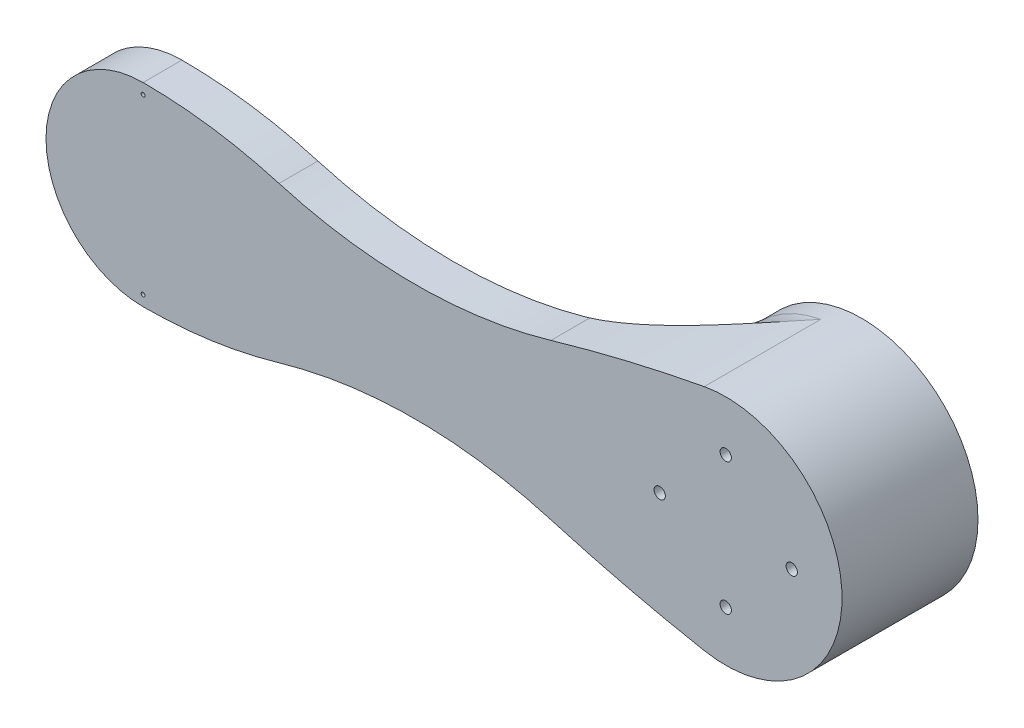
ISO-10303-21;
HEADER;
FILE_DESCRIPTION(('STEP AP214'),'2;1');
FILE_NAME('part.step','',(''),(''),'','','');
FILE_SCHEMA(('AUTOMOTIVE_DESIGN { 1 0 10303 214 1 1 1 1 }'));
ENDSEC;
DATA;
#1=APPLICATION_CONTEXT('core data for automotive mechanical design processes');
#2=APPLICATION_PROTOCOL_DEFINITION('international standard','automotive_design',2000,#1);
#3=PRODUCT_CONTEXT('',#1,'mechanical');
#4=PRODUCT('Part','Part','',(#3));
#5=PRODUCT_RELATED_PRODUCT_CATEGORY('part','',(#4));
#6=PRODUCT_DEFINITION_FORMATION('','',#4);
#7=PRODUCT_DEFINITION_CONTEXT('part definition',#1,'design');
#8=PRODUCT_DEFINITION('design','',#6,#7);
#9=PRODUCT_DEFINITION_SHAPE('','',#8);
#10=(LENGTH_UNIT() NAMED_UNIT(*) SI_UNIT(.MILLI.,.METRE.));
#11=(NAMED_UNIT(*) PLANE_ANGLE_UNIT() SI_UNIT($,.RADIAN.));
#12=(NAMED_UNIT(*) SI_UNIT($,.STERADIAN.) SOLID_ANGLE_UNIT());
#13=UNCERTAINTY_MEASURE_WITH_UNIT(LENGTH_MEASURE(1.E-05),#10,'distance_accuracy_value','');
#14=(GEOMETRIC_REPRESENTATION_CONTEXT(3) GLOBAL_UNCERTAINTY_ASSIGNED_CONTEXT((#13)) GLOBAL_UNIT_ASSIGNED_CONTEXT((#10,
#11,#12)) REPRESENTATION_CONTEXT('',''));
#15=CARTESIAN_POINT('',(0.,0.,0.));
#16=DIRECTION('',(0.,0.,1.));
#17=DIRECTION('',(1.,0.,0.));
#18=AXIS2_PLACEMENT_3D('',#15,#16,#17);
#19=CARTESIAN_POINT('',(0.,0.,30.));
#20=DIRECTION('',(0.,0.,-1.));
#21=DIRECTION('',(-1.,0.,0.));
#22=AXIS2_PLACEMENT_3D('',#19,#20,#21);
#23=CYLINDRICAL_SURFACE('',#22,29.95);
#24=CARTESIAN_POINT('',(0.,0.,0.));
#25=DIRECTION('',(0.,0.,1.));
#26=DIRECTION('',(1.,0.,0.));
#27=AXIS2_PLACEMENT_3D('',#24,#25,#26);
#28=CIRCLE('',#27,29.95);
#29=CARTESIAN_POINT('',(29.95,0.,0.));
#30=VERTEX_POINT('',#29);
#31=EDGE_CURVE('E207',#30,#30,#28,.T.);
#32=ORIENTED_EDGE('',*,*,#31,.T.);
#33=EDGE_LOOP('',(#32));
#34=FACE_BOUND('',#33,.T.);
#35=CARTESIAN_POINT('',(0.,0.,4.99999999999999));
#36=DIRECTION('',(0.,0.,-1.));
#37=DIRECTION('',(-1.,0.,0.));
#38=AXIS2_PLACEMENT_3D('',#35,#36,#37);
#39=CIRCLE('',#38,29.95);
#40=CARTESIAN_POINT('',(-5.52300923487327,-29.4363528479925,4.99999999999999));
#41=VERTEX_POINT('',#40);
#42=CARTESIAN_POINT('',(-5.52300923487327,29.4363528479923,4.99999999999999));
#43=VERTEX_POINT('',#42);
#44=EDGE_CURVE('E252',#41,#43,#39,.T.);
#45=ORIENTED_EDGE('',*,*,#44,.T.);
#46=DIRECTION('',(0.,0.,1.));
#47=VECTOR('',#46,1.);
#48=CARTESIAN_POINT('',(-5.52300923487331,29.4363528479925,25.));
#49=LINE('',#48,#47);
#50=CARTESIAN_POINT('',(-5.52300923487331,29.4363528479925,35.));
#51=VERTEX_POINT('',#50);
#52=EDGE_CURVE('E147',#43,#51,#49,.T.);
#53=ORIENTED_EDGE('',*,*,#52,.T.);
#54=CARTESIAN_POINT('',(0.,0.,35.));
#55=DIRECTION('',(0.,0.,1.));
#56=DIRECTION('',(1.,0.,0.));
#57=AXIS2_PLACEMENT_3D('',#54,#55,#56);
#58=CIRCLE('',#57,29.95);
#59=CARTESIAN_POINT('',(-5.52300923487268,-29.4363528479924,35.));
#60=VERTEX_POINT('',#59);
#61=EDGE_CURVE('E181',#60,#51,#58,.T.);
#62=ORIENTED_EDGE('',*,*,#61,.F.);
#63=DIRECTION('',(0.,0.,1.));
#64=VECTOR('',#63,1.);
#65=CARTESIAN_POINT('',(-5.52300923487327,-29.4363528479925,25.));
#66=LINE('',#65,#64);
#67=EDGE_CURVE('E165',#41,#60,#66,.T.);
#68=ORIENTED_EDGE('',*,*,#67,.F.);
#69=EDGE_LOOP('',(#45,#53,#62,#68));
#70=FACE_BOUND('',#69,.T.);
#71=ADVANCED_FACE('F36',(#34,#70),#23,.T.);
#72=CARTESIAN_POINT('',(0.,0.,0.));
#73=DIRECTION('',(0.,0.,1.));
#74=DIRECTION('',(1.,0.,0.));
#75=AXIS2_PLACEMENT_3D('',#72,#73,#74);
#76=PLANE('',#75);
#77=CARTESIAN_POINT('',(0.,0.,0.));
#78=DIRECTION('',(0.,0.,1.));
#79=DIRECTION('',(1.,0.,0.));
#80=AXIS2_PLACEMENT_3D('',#77,#78,#79);
#81=CIRCLE('',#80,26.95);
#82=CARTESIAN_POINT('',(26.95,0.,0.));
#83=VERTEX_POINT('',#82);
#84=EDGE_CURVE('E222',#83,#83,#81,.T.);
#85=ORIENTED_EDGE('',*,*,#84,.T.);
#86=EDGE_LOOP('',(#85));
#87=FACE_BOUND('',#86,.T.);
#88=ORIENTED_EDGE('',*,*,#31,.F.);
#89=EDGE_LOOP('',(#88));
#90=FACE_BOUND('',#89,.T.);
#91=ADVANCED_FACE('F336',(#87,#90),#76,.F.);
#92=CARTESIAN_POINT('',(0.,0.,30.));
#93=DIRECTION('',(0.,0.,-1.));
#94=DIRECTION('',(-1.,0.,0.));
#95=AXIS2_PLACEMENT_3D('',#92,#93,#94);
#96=CYLINDRICAL_SURFACE('',#95,24.95);
#97=CARTESIAN_POINT('',(0.,0.,2.));
#98=DIRECTION('',(0.,0.,1.));
#99=DIRECTION('',(1.,0.,0.));
#100=AXIS2_PLACEMENT_3D('',#97,#98,#99);
#101=CIRCLE('',#100,24.95);
#102=CARTESIAN_POINT('',(24.95,0.,2.));
#103=VERTEX_POINT('',#102);
#104=EDGE_CURVE('E225',#103,#103,#101,.F.);
#105=ORIENTED_EDGE('',*,*,#104,.T.);
#106=EDGE_LOOP('',(#105));
#107=FACE_BOUND('',#106,.T.);
#108=CARTESIAN_POINT('',(0.,0.,30.));
#109=DIRECTION('',(0.,0.,1.));
#110=DIRECTION('',(1.,0.,0.));
#111=AXIS2_PLACEMENT_3D('',#108,#109,#110);
#112=CIRCLE('',#111,24.95);
#113=CARTESIAN_POINT('',(24.95,0.,30.));
#114=VERTEX_POINT('',#113);
#115=EDGE_CURVE('E204',#114,#114,#112,.T.);
#116=ORIENTED_EDGE('',*,*,#115,.T.);
#117=EDGE_LOOP('',(#116));
#118=FACE_BOUND('',#117,.T.);
#119=ADVANCED_FACE('F332',(#107,#118),#96,.F.);
#120=CARTESIAN_POINT('',(0.,0.,30.));
#121=DIRECTION('',(0.,0.,1.));
#122=DIRECTION('',(1.,0.,0.));
#123=AXIS2_PLACEMENT_3D('',#120,#121,#122);
#124=PLANE('',#123);
#125=CARTESIAN_POINT('',(-17.,0.,30.));
#126=DIRECTION('',(0.,0.,1.));
#127=DIRECTION('',(1.,0.,0.));
#128=AXIS2_PLACEMENT_3D('',#125,#126,#127);
#129=CIRCLE('',#128,3.35);
#130=CARTESIAN_POINT('',(-13.65,0.,30.));
#131=VERTEX_POINT('',#130);
#132=EDGE_CURVE('E219',#131,#131,#129,.F.);
#133=ORIENTED_EDGE('',*,*,#132,.F.);
#134=EDGE_LOOP('',(#133));
#135=FACE_BOUND('',#134,.T.);
#136=CARTESIAN_POINT('',(0.,-17.,30.));
#137=DIRECTION('',(0.,0.,1.));
#138=DIRECTION('',(1.,0.,0.));
#139=AXIS2_PLACEMENT_3D('',#136,#137,#138);
#140=CIRCLE('',#139,3.35);
#141=CARTESIAN_POINT('',(3.35,-17.,30.));
#142=VERTEX_POINT('',#141);
#143=EDGE_CURVE('E216',#142,#142,#140,.F.);
#144=ORIENTED_EDGE('',*,*,#143,.F.);
#145=EDGE_LOOP('',(#144));
#146=FACE_BOUND('',#145,.T.);
#147=CARTESIAN_POINT('',(17.,0.,30.));
#148=DIRECTION('',(0.,0.,1.));
#149=DIRECTION('',(1.,0.,0.));
#150=AXIS2_PLACEMENT_3D('',#147,#148,#149);
#151=CIRCLE('',#150,3.35);
#152=CARTESIAN_POINT('',(20.35,0.,30.));
#153=VERTEX_POINT('',#152);
#154=EDGE_CURVE('E213',#153,#153,#151,.F.);
#155=ORIENTED_EDGE('',*,*,#154,.F.);
#156=EDGE_LOOP('',(#155));
#157=FACE_BOUND('',#156,.T.);
#158=CARTESIAN_POINT('',(0.,17.,30.));
#159=DIRECTION('',(0.,0.,1.));
#160=DIRECTION('',(1.,0.,0.));
#161=AXIS2_PLACEMENT_3D('',#158,#159,#160);
#162=CIRCLE('',#161,3.35);
#163=CARTESIAN_POINT('',(3.35,17.,30.));
#164=VERTEX_POINT('',#163);
#165=EDGE_CURVE('E210',#164,#164,#162,.F.);
#166=ORIENTED_EDGE('',*,*,#165,.F.);
#167=EDGE_LOOP('',(#166));
#168=FACE_BOUND('',#167,.T.);
#169=ORIENTED_EDGE('',*,*,#115,.F.);
#170=EDGE_LOOP('',(#169));
#171=FACE_BOUND('',#170,.T.);
#172=ADVANCED_FACE('F328',(#135,#146,#157,#168,#171),#124,.F.);
#173=CARTESIAN_POINT('',(0.,0.,35.));
#174=DIRECTION('',(0.,0.,1.));
#175=DIRECTION('',(1.,0.,0.));
#176=AXIS2_PLACEMENT_3D('',#173,#174,#175);
#177=PLANE('',#176);
#178=CARTESIAN_POINT('',(0.,17.,35.));
#179=DIRECTION('',(0.,0.,-1.));
#180=DIRECTION('',(-1.,0.,0.));
#181=AXIS2_PLACEMENT_3D('',#178,#179,#180);
#182=CIRCLE('',#181,1.45);
#183=CARTESIAN_POINT('',(-1.45,17.,35.));
#184=VERTEX_POINT('',#183);
#185=EDGE_CURVE('E178',#184,#184,#182,.T.);
#186=ORIENTED_EDGE('',*,*,#185,.T.);
#187=EDGE_LOOP('',(#186));
#188=FACE_BOUND('',#187,.T.);
#189=CARTESIAN_POINT('',(-17.,0.,35.));
#190=DIRECTION('',(0.,0.,-1.));
#191=DIRECTION('',(-1.,0.,0.));
#192=AXIS2_PLACEMENT_3D('',#189,#190,#191);
#193=CIRCLE('',#192,1.45);
#194=CARTESIAN_POINT('',(-18.45,0.,35.));
#195=VERTEX_POINT('',#194);
#196=EDGE_CURVE('E188',#195,#195,#193,.T.);
#197=ORIENTED_EDGE('',*,*,#196,.T.);
#198=EDGE_LOOP('',(#197));
#199=FACE_BOUND('',#198,.T.);
#200=CARTESIAN_POINT('',(17.,0.,35.));
#201=DIRECTION('',(0.,0.,-1.));
#202=DIRECTION('',(-1.,0.,0.));
#203=AXIS2_PLACEMENT_3D('',#200,#201,#202);
#204=CIRCLE('',#203,1.45);
#205=CARTESIAN_POINT('',(15.55,0.,35.));
#206=VERTEX_POINT('',#205);
#207=EDGE_CURVE('E194',#206,#206,#204,.T.);
#208=ORIENTED_EDGE('',*,*,#207,.T.);
#209=EDGE_LOOP('',(#208));
#210=FACE_BOUND('',#209,.T.);
#211=CARTESIAN_POINT('',(0.,-17.,35.));
#212=DIRECTION('',(0.,0.,-1.));
#213=DIRECTION('',(-1.,0.,0.));
#214=AXIS2_PLACEMENT_3D('',#211,#212,#213);
#215=CIRCLE('',#214,1.45);
#216=CARTESIAN_POINT('',(-1.45,-17.,35.));
#217=VERTEX_POINT('',#216);
#218=EDGE_CURVE('E168',#217,#217,#215,.T.);
#219=ORIENTED_EDGE('',*,*,#218,.T.);
#220=EDGE_LOOP('',(#219));
#221=FACE_BOUND('',#220,.T.);
#222=ORIENTED_EDGE('',*,*,#61,.T.);
#223=CARTESIAN_POINT('',(70.6322432432423,-376.453405405403,35.));
#224=DIRECTION('',(0.,0.,1.));
#225=DIRECTION('',(1.,0.,0.));
#226=AXIS2_PLACEMENT_3D('',#223,#224,#225);
#227=CIRCLE('',#226,412.972297297295);
#228=CARTESIAN_POINT('',(-45.,20.,35.));
#229=VERTEX_POINT('',#228);
#230=EDGE_CURVE('E148',#51,#229,#227,.T.);
#231=ORIENTED_EDGE('',*,*,#230,.T.);
#232=CARTESIAN_POINT('',(-80.,140.,35.));
#233=DIRECTION('',(0.,0.,-1.));
#234=DIRECTION('',(-1.,0.,0.));
#235=AXIS2_PLACEMENT_3D('',#232,#233,#234);
#236=CIRCLE('',#235,125.);
#237=CARTESIAN_POINT('',(-115.,20.,35.));
#238=VERTEX_POINT('',#237);
#239=EDGE_CURVE('E151',#229,#238,#236,.T.);
#240=ORIENTED_EDGE('',*,*,#239,.T.);
#241=CARTESIAN_POINT('',(-150.,-99.9999999999997,35.));
#242=DIRECTION('',(0.,0.,1.));
#243=DIRECTION('',(1.,0.,0.));
#244=AXIS2_PLACEMENT_3D('',#241,#242,#243);
#245=CIRCLE('',#244,125.);
#246=CARTESIAN_POINT('',(-150.,25.,35.));
#247=VERTEX_POINT('',#246);
#248=EDGE_CURVE('E128',#238,#247,#245,.T.);
#249=ORIENTED_EDGE('',*,*,#248,.T.);
#250=CARTESIAN_POINT('',(-150.,0.,35.));
#251=DIRECTION('',(0.,0.,1.));
#252=DIRECTION('',(1.,0.,0.));
#253=AXIS2_PLACEMENT_3D('',#250,#251,#252);
#254=CIRCLE('',#253,25.);
#255=CARTESIAN_POINT('',(-150.,-25.,35.));
#256=VERTEX_POINT('',#255);
#257=EDGE_CURVE('E155',#247,#256,#254,.T.);
#258=ORIENTED_EDGE('',*,*,#257,.T.);
#259=CARTESIAN_POINT('',(-150.,99.9999999999997,35.));
#260=DIRECTION('',(0.,0.,1.));
#261=DIRECTION('',(-1.,0.,0.));
#262=AXIS2_PLACEMENT_3D('',#259,#260,#261);
#263=CIRCLE('',#262,125.);
#264=CARTESIAN_POINT('',(-115.,-20.,35.));
#265=VERTEX_POINT('',#264);
#266=EDGE_CURVE('E158',#256,#265,#263,.T.);
#267=ORIENTED_EDGE('',*,*,#266,.T.);
#268=CARTESIAN_POINT('',(-80.,-140.,35.));
#269=DIRECTION('',(0.,0.,-1.));
#270=DIRECTION('',(1.,0.,0.));
#271=AXIS2_PLACEMENT_3D('',#268,#269,#270);
#272=CIRCLE('',#271,125.);
#273=CARTESIAN_POINT('',(-45.,-20.0000000000002,35.));
#274=VERTEX_POINT('',#273);
#275=EDGE_CURVE('E161',#265,#274,#272,.T.);
#276=ORIENTED_EDGE('',*,*,#275,.T.);
#277=CARTESIAN_POINT('',(70.6322432432423,376.453405405403,35.));
#278=DIRECTION('',(0.,0.,1.));
#279=DIRECTION('',(-1.,0.,0.));
#280=AXIS2_PLACEMENT_3D('',#277,#278,#279);
#281=CIRCLE('',#280,412.972297297295);
#282=EDGE_CURVE('E122',#274,#60,#281,.T.);
#283=ORIENTED_EDGE('',*,*,#282,.T.);
#284=EDGE_LOOP('',(#222,#231,#240,#249,#258,#267,#276,#283));
#285=FACE_BOUND('',#284,.T.);
#286=CARTESIAN_POINT('',(-150.,22.2789619905194,35.));
#287=DIRECTION('',(0.,0.,1.));
#288=DIRECTION('',(1.,0.,0.));
#289=AXIS2_PLACEMENT_3D('',#286,#287,#288);
#290=CIRCLE('',#289,0.499999999999999);
#291=CARTESIAN_POINT('',(-149.5,22.2789619905194,35.));
#292=VERTEX_POINT('',#291);
#293=EDGE_CURVE('E703',#292,#292,#290,.T.);
#294=ORIENTED_EDGE('',*,*,#293,.F.);
#295=EDGE_LOOP('',(#294));
#296=FACE_BOUND('',#295,.T.);
#297=CARTESIAN_POINT('',(-150.,-22.2789619905194,35.));
#298=DIRECTION('',(0.,0.,1.));
#299=DIRECTION('',(1.,0.,0.));
#300=AXIS2_PLACEMENT_3D('',#297,#298,#299);
#301=CIRCLE('',#300,0.499999999999999);
#302=CARTESIAN_POINT('',(-149.5,-22.2789619905194,35.));
#303=VERTEX_POINT('',#302);
#304=EDGE_CURVE('E698',#303,#303,#301,.T.);
#305=ORIENTED_EDGE('',*,*,#304,.F.);
#306=EDGE_LOOP('',(#305));
#307=FACE_BOUND('',#306,.T.);
#308=ADVANCED_FACE('F324',(#188,#199,#210,#221,#285,#296,#307),#177,.T.);
#309=CARTESIAN_POINT('',(0.,17.,25.));
#310=DIRECTION('',(0.,0.,1.));
#311=DIRECTION('',(1.,0.,0.));
#312=AXIS2_PLACEMENT_3D('',#309,#310,#311);
#313=CYLINDRICAL_SURFACE('',#312,3.35);
#314=CARTESIAN_POINT('',(0.,17.,26.));
#315=DIRECTION('',(0.,0.,-1.));
#316=DIRECTION('',(-1.,0.,0.));
#317=AXIS2_PLACEMENT_3D('',#314,#315,#316);
#318=CIRCLE('',#317,3.35);
#319=CARTESIAN_POINT('',(-3.35,17.,26.));
#320=VERTEX_POINT('',#319);
#321=EDGE_CURVE('E243',#320,#320,#318,.F.);
#322=ORIENTED_EDGE('',*,*,#321,.T.);
#323=EDGE_LOOP('',(#322));
#324=FACE_BOUND('',#323,.T.);
#325=ORIENTED_EDGE('',*,*,#165,.T.);
#326=EDGE_LOOP('',(#325));
#327=FACE_BOUND('',#326,.T.);
#328=ADVANCED_FACE('F320',(#324,#327),#313,.T.);
#329=CARTESIAN_POINT('',(0.,17.,25.));
#330=DIRECTION('',(0.,0.,-1.));
#331=DIRECTION('',(-1.,0.,0.));
#332=AXIS2_PLACEMENT_3D('',#329,#330,#331);
#333=PLANE('',#332);
#334=CARTESIAN_POINT('',(0.,17.,25.));
#335=DIRECTION('',(0.,0.,-1.));
#336=DIRECTION('',(-1.,0.,0.));
#337=AXIS2_PLACEMENT_3D('',#334,#335,#336);
#338=CIRCLE('',#337,2.35);
#339=CARTESIAN_POINT('',(-2.35,17.,25.));
#340=VERTEX_POINT('',#339);
#341=EDGE_CURVE('E240',#340,#340,#338,.T.);
#342=ORIENTED_EDGE('',*,*,#341,.T.);
#343=EDGE_LOOP('',(#342));
#344=FACE_BOUND('',#343,.T.);
#345=CARTESIAN_POINT('',(0.,17.,25.));
#346=DIRECTION('',(0.,0.,-1.));
#347=DIRECTION('',(-1.,0.,0.));
#348=AXIS2_PLACEMENT_3D('',#345,#346,#347);
#349=CIRCLE('',#348,1.45);
#350=CARTESIAN_POINT('',(-1.45,17.,25.));
#351=VERTEX_POINT('',#350);
#352=EDGE_CURVE('E182',#351,#351,#349,.T.);
#353=ORIENTED_EDGE('',*,*,#352,.F.);
#354=EDGE_LOOP('',(#353));
#355=FACE_BOUND('',#354,.T.);
#356=ADVANCED_FACE('F313',(#344,#355),#333,.T.);
#357=CARTESIAN_POINT('',(17.,0.,25.));
#358=DIRECTION('',(0.,0.,1.));
#359=DIRECTION('',(1.,0.,0.));
#360=AXIS2_PLACEMENT_3D('',#357,#358,#359);
#361=CYLINDRICAL_SURFACE('',#360,3.35);
#362=CARTESIAN_POINT('',(17.,0.,26.));
#363=DIRECTION('',(0.,0.,-1.));
#364=DIRECTION('',(-1.,0.,0.));
#365=AXIS2_PLACEMENT_3D('',#362,#363,#364);
#366=CIRCLE('',#365,3.35);
#367=CARTESIAN_POINT('',(13.65,0.,26.));
#368=VERTEX_POINT('',#367);
#369=EDGE_CURVE('E249',#368,#368,#366,.F.);
#370=ORIENTED_EDGE('',*,*,#369,.T.);
#371=EDGE_LOOP('',(#370));
#372=FACE_BOUND('',#371,.T.);
#373=ORIENTED_EDGE('',*,*,#154,.T.);
#374=EDGE_LOOP('',(#373));
#375=FACE_BOUND('',#374,.T.);
#376=ADVANCED_FACE('F310',(#372,#375),#361,.T.);
#377=CARTESIAN_POINT('',(17.,0.,25.));
#378=DIRECTION('',(0.,0.,-1.));
#379=DIRECTION('',(-1.,0.,0.));
#380=AXIS2_PLACEMENT_3D('',#377,#378,#379);
#381=PLANE('',#380);
#382=CARTESIAN_POINT('',(17.,0.,25.));
#383=DIRECTION('',(0.,0.,-1.));
#384=DIRECTION('',(-1.,0.,0.));
#385=AXIS2_PLACEMENT_3D('',#382,#383,#384);
#386=CIRCLE('',#385,2.35);
#387=CARTESIAN_POINT('',(14.65,0.,25.));
#388=VERTEX_POINT('',#387);
#389=EDGE_CURVE('E246',#388,#388,#386,.T.);
#390=ORIENTED_EDGE('',*,*,#389,.T.);
#391=EDGE_LOOP('',(#390));
#392=FACE_BOUND('',#391,.T.);
#393=CARTESIAN_POINT('',(17.,0.,25.));
#394=DIRECTION('',(0.,0.,-1.));
#395=DIRECTION('',(-1.,0.,0.));
#396=AXIS2_PLACEMENT_3D('',#393,#394,#395);
#397=CIRCLE('',#396,1.45);
#398=CARTESIAN_POINT('',(15.55,0.,25.));
#399=VERTEX_POINT('',#398);
#400=EDGE_CURVE('E191',#399,#399,#397,.T.);
#401=ORIENTED_EDGE('',*,*,#400,.F.);
#402=EDGE_LOOP('',(#401));
#403=FACE_BOUND('',#402,.T.);
#404=ADVANCED_FACE('F305',(#392,#403),#381,.T.);
#405=CARTESIAN_POINT('',(0.,-17.,25.));
#406=DIRECTION('',(0.,0.,1.));
#407=DIRECTION('',(1.,0.,0.));
#408=AXIS2_PLACEMENT_3D('',#405,#406,#407);
#409=CYLINDRICAL_SURFACE('',#408,3.35);
#410=CARTESIAN_POINT('',(0.,-17.,26.));
#411=DIRECTION('',(0.,0.,-1.));
#412=DIRECTION('',(-1.,0.,0.));
#413=AXIS2_PLACEMENT_3D('',#410,#411,#412);
#414=CIRCLE('',#413,3.35);
#415=CARTESIAN_POINT('',(-3.35,-17.,26.));
#416=VERTEX_POINT('',#415);
#417=EDGE_CURVE('E231',#416,#416,#414,.F.);
#418=ORIENTED_EDGE('',*,*,#417,.T.);
#419=EDGE_LOOP('',(#418));
#420=FACE_BOUND('',#419,.T.);
#421=ORIENTED_EDGE('',*,*,#143,.T.);
#422=EDGE_LOOP('',(#421));
#423=FACE_BOUND('',#422,.T.);
#424=ADVANCED_FACE('F302',(#420,#423),#409,.T.);
#425=CARTESIAN_POINT('',(0.,-17.,25.));
#426=DIRECTION('',(0.,0.,-1.));
#427=DIRECTION('',(-1.,0.,0.));
#428=AXIS2_PLACEMENT_3D('',#425,#426,#427);
#429=PLANE('',#428);
#430=CARTESIAN_POINT('',(0.,-17.,25.));
#431=DIRECTION('',(0.,0.,-1.));
#432=DIRECTION('',(-1.,0.,0.));
#433=AXIS2_PLACEMENT_3D('',#430,#431,#432);
#434=CIRCLE('',#433,2.35);
#435=CARTESIAN_POINT('',(-2.35,-17.,25.));
#436=VERTEX_POINT('',#435);
#437=EDGE_CURVE('E228',#436,#436,#434,.T.);
#438=ORIENTED_EDGE('',*,*,#437,.T.);
#439=EDGE_LOOP('',(#438));
#440=FACE_BOUND('',#439,.T.);
#441=CARTESIAN_POINT('',(0.,-17.,25.));
#442=DIRECTION('',(0.,0.,-1.));
#443=DIRECTION('',(-1.,0.,0.));
#444=AXIS2_PLACEMENT_3D('',#441,#442,#443);
#445=CIRCLE('',#444,1.45);
#446=CARTESIAN_POINT('',(-1.45,-17.,25.));
#447=VERTEX_POINT('',#446);
#448=EDGE_CURVE('E197',#447,#447,#445,.T.);
#449=ORIENTED_EDGE('',*,*,#448,.F.);
#450=EDGE_LOOP('',(#449));
#451=FACE_BOUND('',#450,.T.);
#452=ADVANCED_FACE('F297',(#440,#451),#429,.T.);
#453=CARTESIAN_POINT('',(-17.,0.,25.));
#454=DIRECTION('',(0.,0.,1.));
#455=DIRECTION('',(1.,0.,0.));
#456=AXIS2_PLACEMENT_3D('',#453,#454,#455);
#457=CYLINDRICAL_SURFACE('',#456,3.35);
#458=CARTESIAN_POINT('',(-17.,0.,26.));
#459=DIRECTION('',(0.,0.,-1.));
#460=DIRECTION('',(-1.,0.,0.));
#461=AXIS2_PLACEMENT_3D('',#458,#459,#460);
#462=CIRCLE('',#461,3.35);
#463=CARTESIAN_POINT('',(-20.35,0.,26.));
#464=VERTEX_POINT('',#463);
#465=EDGE_CURVE('E237',#464,#464,#462,.F.);
#466=ORIENTED_EDGE('',*,*,#465,.T.);
#467=EDGE_LOOP('',(#466));
#468=FACE_BOUND('',#467,.T.);
#469=ORIENTED_EDGE('',*,*,#132,.T.);
#470=EDGE_LOOP('',(#469));
#471=FACE_BOUND('',#470,.T.);
#472=ADVANCED_FACE('F294',(#468,#471),#457,.T.);
#473=CARTESIAN_POINT('',(-17.,0.,25.));
#474=DIRECTION('',(0.,0.,-1.));
#475=DIRECTION('',(-1.,0.,0.));
#476=AXIS2_PLACEMENT_3D('',#473,#474,#475);
#477=PLANE('',#476);
#478=CARTESIAN_POINT('',(-17.,0.,25.));
#479=DIRECTION('',(0.,0.,-1.));
#480=DIRECTION('',(-1.,0.,0.));
#481=AXIS2_PLACEMENT_3D('',#478,#479,#480);
#482=CIRCLE('',#481,2.35);
#483=CARTESIAN_POINT('',(-19.35,0.,25.));
#484=VERTEX_POINT('',#483);
#485=EDGE_CURVE('E234',#484,#484,#482,.T.);
#486=ORIENTED_EDGE('',*,*,#485,.T.);
#487=EDGE_LOOP('',(#486));
#488=FACE_BOUND('',#487,.T.);
#489=CARTESIAN_POINT('',(-17.,0.,25.));
#490=DIRECTION('',(0.,0.,-1.));
#491=DIRECTION('',(-1.,0.,0.));
#492=AXIS2_PLACEMENT_3D('',#489,#490,#491);
#493=CIRCLE('',#492,1.45);
#494=CARTESIAN_POINT('',(-18.45,0.,25.));
#495=VERTEX_POINT('',#494);
#496=EDGE_CURVE('E185',#495,#495,#493,.T.);
#497=ORIENTED_EDGE('',*,*,#496,.F.);
#498=EDGE_LOOP('',(#497));
#499=FACE_BOUND('',#498,.T.);
#500=ADVANCED_FACE('F286',(#488,#499),#477,.T.);
#501=CARTESIAN_POINT('',(-17.,0.,35.));
#502=DIRECTION('',(0.,0.,-1.));
#503=DIRECTION('',(-1.,0.,0.));
#504=AXIS2_PLACEMENT_3D('',#501,#502,#503);
#505=CYLINDRICAL_SURFACE('',#504,1.45);
#506=ORIENTED_EDGE('',*,*,#196,.F.);
#507=EDGE_LOOP('',(#506));
#508=FACE_BOUND('',#507,.T.);
#509=ORIENTED_EDGE('',*,*,#496,.T.);
#510=EDGE_LOOP('',(#509));
#511=FACE_BOUND('',#510,.T.);
#512=ADVANCED_FACE('F282',(#508,#511),#505,.F.);
#513=CARTESIAN_POINT('',(0.,-17.,35.));
#514=DIRECTION('',(0.,0.,-1.));
#515=DIRECTION('',(-1.,0.,0.));
#516=AXIS2_PLACEMENT_3D('',#513,#514,#515);
#517=CYLINDRICAL_SURFACE('',#516,1.45);
#518=ORIENTED_EDGE('',*,*,#218,.F.);
#519=EDGE_LOOP('',(#518));
#520=FACE_BOUND('',#519,.T.);
#521=ORIENTED_EDGE('',*,*,#448,.T.);
#522=EDGE_LOOP('',(#521));
#523=FACE_BOUND('',#522,.T.);
#524=ADVANCED_FACE('F285',(#520,#523),#517,.F.);
#525=CARTESIAN_POINT('',(17.,0.,35.));
#526=DIRECTION('',(0.,0.,-1.));
#527=DIRECTION('',(-1.,0.,0.));
#528=AXIS2_PLACEMENT_3D('',#525,#526,#527);
#529=CYLINDRICAL_SURFACE('',#528,1.45);
#530=ORIENTED_EDGE('',*,*,#207,.F.);
#531=EDGE_LOOP('',(#530));
#532=FACE_BOUND('',#531,.T.);
#533=ORIENTED_EDGE('',*,*,#400,.T.);
#534=EDGE_LOOP('',(#533));
#535=FACE_BOUND('',#534,.T.);
#536=ADVANCED_FACE('F280',(#532,#535),#529,.F.);
#537=CARTESIAN_POINT('',(0.,17.,35.));
#538=DIRECTION('',(0.,0.,-1.));
#539=DIRECTION('',(-1.,0.,0.));
#540=AXIS2_PLACEMENT_3D('',#537,#538,#539);
#541=CYLINDRICAL_SURFACE('',#540,1.45);
#542=ORIENTED_EDGE('',*,*,#185,.F.);
#543=EDGE_LOOP('',(#542));
#544=FACE_BOUND('',#543,.T.);
#545=ORIENTED_EDGE('',*,*,#352,.T.);
#546=EDGE_LOOP('',(#545));
#547=FACE_BOUND('',#546,.T.);
#548=ADVANCED_FACE('F276',(#544,#547),#541,.F.);
#549=CARTESIAN_POINT('',(0.,0.,2.));
#550=DIRECTION('',(0.,0.,1.));
#551=DIRECTION('',(1.,0.,0.));
#552=AXIS2_PLACEMENT_3D('',#549,#550,#551);
#553=TOROIDAL_SURFACE('',#552,26.95,2.);
#554=ORIENTED_EDGE('',*,*,#104,.F.);
#555=EDGE_LOOP('',(#554));
#556=FACE_BOUND('',#555,.T.);
#557=ORIENTED_EDGE('',*,*,#84,.F.);
#558=EDGE_LOOP('',(#557));
#559=FACE_BOUND('',#558,.T.);
#560=ADVANCED_FACE('F279',(#556,#559),#553,.T.);
#561=CARTESIAN_POINT('',(0.,-17.,26.));
#562=DIRECTION('',(0.,0.,-1.));
#563=DIRECTION('',(-1.,0.,0.));
#564=AXIS2_PLACEMENT_3D('',#561,#562,#563);
#565=TOROIDAL_SURFACE('',#564,2.35,1.);
#566=ORIENTED_EDGE('',*,*,#417,.F.);
#567=EDGE_LOOP('',(#566));
#568=FACE_BOUND('',#567,.T.);
#569=ORIENTED_EDGE('',*,*,#437,.F.);
#570=EDGE_LOOP('',(#569));
#571=FACE_BOUND('',#570,.T.);
#572=ADVANCED_FACE('F346',(#568,#571),#565,.T.);
#573=CARTESIAN_POINT('',(-17.,0.,26.));
#574=DIRECTION('',(0.,0.,-1.));
#575=DIRECTION('',(-1.,0.,0.));
#576=AXIS2_PLACEMENT_3D('',#573,#574,#575);
#577=TOROIDAL_SURFACE('',#576,2.35,1.);
#578=ORIENTED_EDGE('',*,*,#465,.F.);
#579=EDGE_LOOP('',(#578));
#580=FACE_BOUND('',#579,.T.);
#581=ORIENTED_EDGE('',*,*,#485,.F.);
#582=EDGE_LOOP('',(#581));
#583=FACE_BOUND('',#582,.T.);
#584=ADVANCED_FACE('F350',(#580,#583),#577,.T.);
#585=CARTESIAN_POINT('',(0.,17.,26.));
#586=DIRECTION('',(0.,0.,-1.));
#587=DIRECTION('',(-1.,0.,0.));
#588=AXIS2_PLACEMENT_3D('',#585,#586,#587);
#589=TOROIDAL_SURFACE('',#588,2.35,1.);
#590=ORIENTED_EDGE('',*,*,#321,.F.);
#591=EDGE_LOOP('',(#590));
#592=FACE_BOUND('',#591,.T.);
#593=ORIENTED_EDGE('',*,*,#341,.F.);
#594=EDGE_LOOP('',(#593));
#595=FACE_BOUND('',#594,.T.);
#596=ADVANCED_FACE('F354',(#592,#595),#589,.T.);
#597=CARTESIAN_POINT('',(17.,0.,26.));
#598=DIRECTION('',(0.,0.,-1.));
#599=DIRECTION('',(-1.,0.,0.));
#600=AXIS2_PLACEMENT_3D('',#597,#598,#599);
#601=TOROIDAL_SURFACE('',#600,2.35,1.);
#602=ORIENTED_EDGE('',*,*,#369,.F.);
#603=EDGE_LOOP('',(#602));
#604=FACE_BOUND('',#603,.T.);
#605=ORIENTED_EDGE('',*,*,#389,.F.);
#606=EDGE_LOOP('',(#605));
#607=FACE_BOUND('',#606,.T.);
#608=ADVANCED_FACE('F357',(#604,#607),#601,.T.);
#609=CARTESIAN_POINT('',(70.6322432432423,376.453405405403,25.));
#610=DIRECTION('',(0.,0.,1.));
#611=DIRECTION('',(1.,0.,0.));
#612=AXIS2_PLACEMENT_3D('',#609,#610,#611);
#613=CYLINDRICAL_SURFACE('',#612,412.972297297295);
#614=ORIENTED_EDGE('',*,*,#282,.F.);
#615=DIRECTION('',(0.,0.,1.));
#616=VECTOR('',#615,1.);
#617=CARTESIAN_POINT('',(-45.,-20.0000000000002,25.));
#618=LINE('',#617,#616);
#619=CARTESIAN_POINT('',(-45.,-20.0000000000002,24.987545422016));
#620=VERTEX_POINT('',#619);
#621=EDGE_CURVE('E56',#620,#274,#618,.T.);
#622=ORIENTED_EDGE('',*,*,#621,.F.);
#623=CARTESIAN_POINT('',(-44.9999999999999,-20.,24.987545422016));
#624=CARTESIAN_POINT('',(-43.929367483011,-20.3123099169504,24.9575065142141));
#625=CARTESIAN_POINT('',(-42.8597129119626,-20.6195461928645,24.873478352925));
#626=CARTESIAN_POINT('',(-40.7311466786708,-21.2217456791171,24.6076204982999));
#627=CARTESIAN_POINT('',(-39.6722189232096,-21.5167303461673,24.4259702911538));
#628=CARTESIAN_POINT('',(-37.5847280235147,-22.0893944688891,23.9780397205332));
#629=CARTESIAN_POINT('',(-36.5559472700879,-22.3672591706632,23.7129876432686));
#630=CARTESIAN_POINT('',(-34.5170671404943,-22.9096551426293,23.1067335539767));
#631=CARTESIAN_POINT('',(-33.506978554086,-23.1741788551351,22.7654889598367));
#632=CARTESIAN_POINT('',(-30.8742964931103,-23.8532092472426,21.7779663884865));
#633=CARTESIAN_POINT('',(-29.2697590011946,-24.2563747651848,21.075533843342));
#634=CARTESIAN_POINT('',(-26.1224721174462,-25.0279442467949,19.5283453281224));
#635=CARTESIAN_POINT('',(-24.5797590600549,-25.3963279366174,18.6835071410781));
#636=CARTESIAN_POINT('',(-21.5422482290989,-26.1039568227393,16.8793025753612));
#637=CARTESIAN_POINT('',(-20.0478347092178,-26.4429932537761,15.9192158824882));
#638=CARTESIAN_POINT('',(-17.1077492098917,-27.0934684700142,13.9199692540521));
#639=CARTESIAN_POINT('',(-15.6620695729822,-27.4049116035393,12.880821825517));
#640=CARTESIAN_POINT('',(-12.7614206128536,-28.0139953003922,10.7187395232247));
#641=CARTESIAN_POINT('',(-11.3074991042769,-28.3109308670404,9.59421938266981));
#642=CARTESIAN_POINT('',(-8.41977588023635,-28.8847987980264,7.32053211816142));
#643=CARTESIAN_POINT('',(-6.98594198273257,-29.1617670705766,6.17141431570921));
#644=CARTESIAN_POINT('',(-5.54151474002465,-29.432880414996,5.01481778617005));
#645=CARTESIAN_POINT('',(-5.53226201665558,-29.4346167889832,5.00740889276049));
#646=CARTESIAN_POINT('',(-5.52300923487268,-29.4363528479924,4.99999999999999));
#647=B_SPLINE_CURVE_WITH_KNOTS('',3,(#623,#624,#625,#626,#627,#628,#629,#630,#631,#632,#633,
#634,#635,#636,#637,#638,#639,#640,#641,#642,#643,#644,#645,#646),.UNSPECIFIED.,.F.,.F.,(4,2,2,
2,2,2,2,2,2,2,2,4),(0.,3.34435207687971,6.68257621792493,9.97377279131673,13.2668133576578,
18.649477659361,24.0352603186919,29.4566531941815,34.877190207559,40.4621097945195,
46.0367213411362,46.0726612391686),.UNSPECIFIED.);
#648=EDGE_CURVE('E11',#620,#41,#647,.T.);
#649=ORIENTED_EDGE('',*,*,#648,.T.);
#650=ORIENTED_EDGE('',*,*,#67,.T.);
#651=EDGE_LOOP('',(#614,#622,#649,#650));
#652=FACE_BOUND('',#651,.T.);
#653=ADVANCED_FACE('F360',(#652),#613,.T.);
#654=CARTESIAN_POINT('',(-80.,-140.,25.));
#655=DIRECTION('',(0.,0.,1.));
#656=DIRECTION('',(1.,0.,0.));
#657=AXIS2_PLACEMENT_3D('',#654,#655,#656);
#658=CYLINDRICAL_SURFACE('',#657,125.);
#659=ORIENTED_EDGE('',*,*,#275,.F.);
#660=DIRECTION('',(0.,0.,1.));
#661=VECTOR('',#660,1.);
#662=CARTESIAN_POINT('',(-115.,-20.,25.));
#663=LINE('',#662,#661);
#664=CARTESIAN_POINT('',(-115.,-20.,25.));
#665=VERTEX_POINT('',#664);
#666=EDGE_CURVE('E170',#665,#265,#663,.T.);
#667=ORIENTED_EDGE('',*,*,#666,.F.);
#668=CARTESIAN_POINT('',(-80.,-140.,25.));
#669=DIRECTION('',(0.,0.,-1.));
#670=DIRECTION('',(1.,0.,0.));
#671=AXIS2_PLACEMENT_3D('',#668,#669,#670);
#672=CIRCLE('',#671,125.);
#673=CARTESIAN_POINT('',(-45.8811286688908,-19.7465068320624,25.));
#674=VERTEX_POINT('',#673);
#675=EDGE_CURVE('E144',#665,#674,#672,.T.);
#676=ORIENTED_EDGE('',*,*,#675,.T.);
#677=CARTESIAN_POINT('',(-45.8811286688908,-19.7465068320624,25.));
#678=CARTESIAN_POINT('',(-45.73409202696,-19.7882248495206,24.9999835994799));
#679=CARTESIAN_POINT('',(-45.58714630038,-19.8302082937355,24.9989375172549));
#680=CARTESIAN_POINT('',(-45.293436744165,-19.9147060166209,24.9947859903313));
#681=CARTESIAN_POINT('',(-45.1466729144481,-19.9572202950519,24.9916805465617));
#682=CARTESIAN_POINT('',(-44.9999999999999,-20.,24.987545422016));
#683=B_SPLINE_CURVE_WITH_KNOTS('',3,(#677,#678,#679,#680,#681,#682),.UNSPECIFIED.,.F.,.F.,(4,2,
4),(0.,0.458487463216428,0.916974719617671),.UNSPECIFIED.);
#684=EDGE_CURVE('E50',#674,#620,#683,.T.);
#685=ORIENTED_EDGE('',*,*,#684,.T.);
#686=ORIENTED_EDGE('',*,*,#621,.T.);
#687=EDGE_LOOP('',(#659,#667,#676,#685,#686));
#688=FACE_BOUND('',#687,.T.);
#689=ADVANCED_FACE('F365',(#688),#658,.F.);
#690=CARTESIAN_POINT('',(-150.,99.9999999999997,25.));
#691=DIRECTION('',(0.,0.,1.));
#692=DIRECTION('',(1.,0.,0.));
#693=AXIS2_PLACEMENT_3D('',#690,#691,#692);
#694=CYLINDRICAL_SURFACE('',#693,125.);
#695=ORIENTED_EDGE('',*,*,#266,.F.);
#696=DIRECTION('',(0.,0.,1.));
#697=VECTOR('',#696,1.);
#698=CARTESIAN_POINT('',(-150.,-25.,25.));
#699=LINE('',#698,#697);
#700=CARTESIAN_POINT('',(-150.,-25.,25.));
#701=VERTEX_POINT('',#700);
#702=EDGE_CURVE('E172',#701,#256,#699,.T.);
#703=ORIENTED_EDGE('',*,*,#702,.F.);
#704=CARTESIAN_POINT('',(-150.,99.9999999999997,25.));
#705=DIRECTION('',(0.,0.,1.));
#706=DIRECTION('',(-1.,0.,0.));
#707=AXIS2_PLACEMENT_3D('',#704,#705,#706);
#708=CIRCLE('',#707,125.);
#709=EDGE_CURVE('E138',#701,#665,#708,.T.);
#710=ORIENTED_EDGE('',*,*,#709,.T.);
#711=ORIENTED_EDGE('',*,*,#666,.T.);
#712=EDGE_LOOP('',(#695,#703,#710,#711));
#713=FACE_BOUND('',#712,.T.);
#714=ADVANCED_FACE('F384',(#713),#694,.T.);
#715=CARTESIAN_POINT('',(-150.,0.,25.));
#716=DIRECTION('',(0.,0.,1.));
#717=DIRECTION('',(1.,0.,0.));
#718=AXIS2_PLACEMENT_3D('',#715,#716,#717);
#719=CYLINDRICAL_SURFACE('',#718,25.);
#720=ORIENTED_EDGE('',*,*,#257,.F.);
#721=DIRECTION('',(0.,0.,1.));
#722=VECTOR('',#721,1.);
#723=CARTESIAN_POINT('',(-150.,25.,25.));
#724=LINE('',#723,#722);
#725=CARTESIAN_POINT('',(-150.,25.,25.));
#726=VERTEX_POINT('',#725);
#727=EDGE_CURVE('E130',#726,#247,#724,.T.);
#728=ORIENTED_EDGE('',*,*,#727,.F.);
#729=CARTESIAN_POINT('',(-150.,0.,25.));
#730=DIRECTION('',(0.,0.,1.));
#731=DIRECTION('',(1.,0.,0.));
#732=AXIS2_PLACEMENT_3D('',#729,#730,#731);
#733=CIRCLE('',#732,25.);
#734=EDGE_CURVE('E136',#726,#701,#733,.T.);
#735=ORIENTED_EDGE('',*,*,#734,.T.);
#736=ORIENTED_EDGE('',*,*,#702,.T.);
#737=EDGE_LOOP('',(#720,#728,#735,#736));
#738=FACE_BOUND('',#737,.T.);
#739=ADVANCED_FACE('F412',(#738),#719,.T.);
#740=CARTESIAN_POINT('',(-150.,-99.9999999999997,25.));
#741=DIRECTION('',(0.,0.,1.));
#742=DIRECTION('',(1.,0.,0.));
#743=AXIS2_PLACEMENT_3D('',#740,#741,#742);
#744=CYLINDRICAL_SURFACE('',#743,125.);
#745=ORIENTED_EDGE('',*,*,#248,.F.);
#746=DIRECTION('',(0.,0.,1.));
#747=VECTOR('',#746,1.);
#748=CARTESIAN_POINT('',(-115.,20.,25.));
#749=LINE('',#748,#747);
#750=CARTESIAN_POINT('',(-115.,20.,25.));
#751=VERTEX_POINT('',#750);
#752=EDGE_CURVE('E114',#751,#238,#749,.T.);
#753=ORIENTED_EDGE('',*,*,#752,.F.);
#754=CARTESIAN_POINT('',(-150.,-99.9999999999997,25.));
#755=DIRECTION('',(0.,0.,1.));
#756=DIRECTION('',(1.,0.,0.));
#757=AXIS2_PLACEMENT_3D('',#754,#755,#756);
#758=CIRCLE('',#757,125.);
#759=EDGE_CURVE('E121',#751,#726,#758,.T.);
#760=ORIENTED_EDGE('',*,*,#759,.T.);
#761=ORIENTED_EDGE('',*,*,#727,.T.);
#762=EDGE_LOOP('',(#745,#753,#760,#761));
#763=FACE_BOUND('',#762,.T.);
#764=ADVANCED_FACE('F126',(#763),#744,.T.);
#765=CARTESIAN_POINT('',(-80.,140.,25.));
#766=DIRECTION('',(0.,0.,1.));
#767=DIRECTION('',(1.,0.,0.));
#768=AXIS2_PLACEMENT_3D('',#765,#766,#767);
#769=CYLINDRICAL_SURFACE('',#768,125.);
#770=ORIENTED_EDGE('',*,*,#239,.F.);
#771=DIRECTION('',(0.,0.,1.));
#772=VECTOR('',#771,1.);
#773=CARTESIAN_POINT('',(-45.,20.,25.));
#774=LINE('',#773,#772);
#775=CARTESIAN_POINT('',(-45.,20.,24.987545422016));
#776=VERTEX_POINT('',#775);
#777=EDGE_CURVE('E64',#776,#229,#774,.T.);
#778=ORIENTED_EDGE('',*,*,#777,.F.);
#779=CARTESIAN_POINT('',(-45.0000000000001,20.0000000000002,24.987545422016));
#780=CARTESIAN_POINT('',(-45.1466729144482,19.957220295052,24.9916805465617));
#781=CARTESIAN_POINT('',(-45.2934367441652,19.9147060166209,24.9947859903313));
#782=CARTESIAN_POINT('',(-45.58714630038,19.8302082937355,24.9989375172549));
#783=CARTESIAN_POINT('',(-45.73409202696,19.7882248495206,24.9999835994799));
#784=CARTESIAN_POINT('',(-45.8811286688908,19.7465068320624,25.));
#785=B_SPLINE_CURVE_WITH_KNOTS('',3,(#779,#780,#781,#782,#783,#784),.UNSPECIFIED.,.F.,.F.,(4,2,
4),(0.,0.458487256401177,0.916974719617528),.UNSPECIFIED.);
#786=CARTESIAN_POINT('',(-45.8811286688908,19.7465068320624,25.));
#787=VERTEX_POINT('',#786);
#788=EDGE_CURVE('E117',#776,#787,#785,.T.);
#789=ORIENTED_EDGE('',*,*,#788,.T.);
#790=CARTESIAN_POINT('',(-80.,140.,25.));
#791=DIRECTION('',(0.,0.,-1.));
#792=DIRECTION('',(-1.,0.,0.));
#793=AXIS2_PLACEMENT_3D('',#790,#791,#792);
#794=CIRCLE('',#793,125.);
#795=EDGE_CURVE('E111',#787,#751,#794,.T.);
#796=ORIENTED_EDGE('',*,*,#795,.T.);
#797=ORIENTED_EDGE('',*,*,#752,.T.);
#798=EDGE_LOOP('',(#770,#778,#789,#796,#797));
#799=FACE_BOUND('',#798,.T.);
#800=ADVANCED_FACE('F113',(#799),#769,.F.);
#801=CARTESIAN_POINT('',(70.6322432432423,-376.453405405403,25.));
#802=DIRECTION('',(0.,0.,1.));
#803=DIRECTION('',(1.,0.,0.));
#804=AXIS2_PLACEMENT_3D('',#801,#802,#803);
#805=CYLINDRICAL_SURFACE('',#804,412.972297297295);
#806=ORIENTED_EDGE('',*,*,#230,.F.);
#807=ORIENTED_EDGE('',*,*,#52,.F.);
#808=CARTESIAN_POINT('',(-45.0000000000001,20.0000000000002,24.987545422016));
#809=CARTESIAN_POINT('',(-43.9293674830014,20.3123099169534,24.9575065142138));
#810=CARTESIAN_POINT('',(-42.8597129119431,20.6195461928701,24.8734783529234));
#811=CARTESIAN_POINT('',(-40.7311466786313,21.2217456791282,24.6076204982941));
#812=CARTESIAN_POINT('',(-39.67221892316,21.516730346181,24.4259702911449));
#813=CARTESIAN_POINT('',(-37.5847280234654,22.0893944689025,23.9780397205209));
#814=CARTESIAN_POINT('',(-36.5559472700485,22.3672591706738,23.7129876432576));
#815=CARTESIAN_POINT('',(-34.5170671404749,22.9096551426344,23.1067335539702));
#816=CARTESIAN_POINT('',(-33.5069785540766,23.1741788551376,22.7654889598333));
#817=CARTESIAN_POINT('',(-30.8742964931184,23.8532092472406,21.7779663884895));
#818=CARTESIAN_POINT('',(-29.2697590012103,24.256374765181,21.0755338433483));
#819=CARTESIAN_POINT('',(-26.1224721174739,25.0279442467883,19.5283453281375));
#820=CARTESIAN_POINT('',(-24.5797590600871,25.3963279366097,18.6835071410986));
#821=CARTESIAN_POINT('',(-21.5422482291313,26.103956822732,16.8793025753791));
#822=CARTESIAN_POINT('',(-20.0478347092465,26.4429932537698,15.9192158824972));
#823=CARTESIAN_POINT('',(-17.1077492098974,27.0934684700128,13.9199692540666));
#824=CARTESIAN_POINT('',(-15.6620695729686,27.4049116035418,12.880821825546));
#825=CARTESIAN_POINT('',(-12.7614206128726,28.0139953003886,10.7187395231985));
#826=CARTESIAN_POINT('',(-11.3074991043499,28.3109308670264,9.5942193825713));
#827=CARTESIAN_POINT('',(-8.41977588015959,28.8847987980411,7.3205321182566));
#828=CARTESIAN_POINT('',(-6.98594198245247,29.1617670706303,6.17141431606982));
#829=CARTESIAN_POINT('',(-5.54151474002122,29.4328804149967,5.01481778617483));
#830=CARTESIAN_POINT('',(-5.53226201665386,29.4346167889836,5.00740889276289));
#831=CARTESIAN_POINT('',(-5.52300923487268,29.4363528479924,4.99999999999999));
#832=B_SPLINE_CURVE_WITH_KNOTS('',3,(#808,#809,#810,#811,#812,#813,#814,#815,#816,#817,#818,
#819,#820,#821,#822,#823,#824,#825,#826,#827,#828,#829,#830,#831),.UNSPECIFIED.,.F.,.F.,(4,2,2,
2,2,2,2,2,2,2,2,4),(0.,3.34435207691041,6.68257621798797,9.97377279134872,13.2668133576574,
18.6494776593356,24.035260318646,29.4566531941616,34.8771902075586,40.4621097945236,
46.0367213411361,46.0726612391688),.UNSPECIFIED.);
#833=EDGE_CURVE('E257',#43,#776,#832,.F.);
#834=ORIENTED_EDGE('',*,*,#833,.T.);
#835=ORIENTED_EDGE('',*,*,#777,.T.);
#836=EDGE_LOOP('',(#806,#807,#834,#835));
#837=FACE_BOUND('',#836,.T.);
#838=ADVANCED_FACE('F269',(#837),#805,.T.);
#839=CARTESIAN_POINT('',(35.3161216216215,-188.226702702702,25.));
#840=DIRECTION('',(0.,0.,-1.));
#841=DIRECTION('',(-1.,0.,0.));
#842=AXIS2_PLACEMENT_3D('',#839,#840,#841);
#843=PLANE('',#842);
#844=CARTESIAN_POINT('',(-150.,22.2789619905194,25.));
#845=DIRECTION('',(0.,0.,1.));
#846=DIRECTION('',(1.,0.,0.));
#847=AXIS2_PLACEMENT_3D('',#844,#845,#846);
#848=CIRCLE('',#847,0.499999999999999);
#849=CARTESIAN_POINT('',(-149.5,22.2789619905194,25.));
#850=VERTEX_POINT('',#849);
#851=EDGE_CURVE('E700',#850,#850,#848,.T.);
#852=ORIENTED_EDGE('',*,*,#851,.T.);
#853=EDGE_LOOP('',(#852));
#854=FACE_BOUND('',#853,.T.);
#855=CARTESIAN_POINT('',(-150.,-22.2789619905194,25.));
#856=DIRECTION('',(0.,0.,1.));
#857=DIRECTION('',(1.,0.,0.));
#858=AXIS2_PLACEMENT_3D('',#855,#856,#857);
#859=CIRCLE('',#858,0.499999999999999);
#860=CARTESIAN_POINT('',(-149.5,-22.2789619905194,25.));
#861=VERTEX_POINT('',#860);
#862=EDGE_CURVE('E152',#861,#861,#859,.T.);
#863=ORIENTED_EDGE('',*,*,#862,.T.);
#864=EDGE_LOOP('',(#863));
#865=FACE_BOUND('',#864,.T.);
#866=ORIENTED_EDGE('',*,*,#795,.F.);
#867=CARTESIAN_POINT('',(0.,0.,25.));
#868=DIRECTION('',(0.,0.,-1.));
#869=DIRECTION('',(-1.,0.,0.));
#870=AXIS2_PLACEMENT_3D('',#867,#868,#869);
#871=CIRCLE('',#870,49.95);
#872=EDGE_CURVE('E255',#787,#674,#871,.F.);
#873=ORIENTED_EDGE('',*,*,#872,.T.);
#874=ORIENTED_EDGE('',*,*,#675,.F.);
#875=ORIENTED_EDGE('',*,*,#709,.F.);
#876=ORIENTED_EDGE('',*,*,#734,.F.);
#877=ORIENTED_EDGE('',*,*,#759,.F.);
#878=EDGE_LOOP('',(#866,#873,#874,#875,#876,#877));
#879=FACE_BOUND('',#878,.T.);
#880=ADVANCED_FACE('F133',(#854,#865,#879),#843,.T.);
#881=CARTESIAN_POINT('',(-150.,-22.2789619905194,25.));
#882=DIRECTION('',(0.,0.,1.));
#883=DIRECTION('',(1.,0.,0.));
#884=AXIS2_PLACEMENT_3D('',#881,#882,#883);
#885=CYLINDRICAL_SURFACE('',#884,0.499999999999999);
#886=ORIENTED_EDGE('',*,*,#862,.F.);
#887=EDGE_LOOP('',(#886));
#888=FACE_BOUND('',#887,.T.);
#889=ORIENTED_EDGE('',*,*,#304,.T.);
#890=EDGE_LOOP('',(#889));
#891=FACE_BOUND('',#890,.T.);
#892=ADVANCED_FACE('F453',(#888,#891),#885,.F.);
#893=CARTESIAN_POINT('',(-150.,22.2789619905194,25.));
#894=DIRECTION('',(0.,0.,1.));
#895=DIRECTION('',(1.,0.,0.));
#896=AXIS2_PLACEMENT_3D('',#893,#894,#895);
#897=CYLINDRICAL_SURFACE('',#896,0.499999999999999);
#898=ORIENTED_EDGE('',*,*,#851,.F.);
#899=EDGE_LOOP('',(#898));
#900=FACE_BOUND('',#899,.T.);
#901=ORIENTED_EDGE('',*,*,#293,.T.);
#902=EDGE_LOOP('',(#901));
#903=FACE_BOUND('',#902,.T.);
#904=ADVANCED_FACE('F464',(#900,#903),#897,.F.);
#905=CARTESIAN_POINT('',(0.,0.,4.99999999999999));
#906=DIRECTION('',(0.,0.,-1.));
#907=DIRECTION('',(-1.,0.,0.));
#908=AXIS2_PLACEMENT_3D('',#905,#906,#907);
#909=TOROIDAL_SURFACE('',#908,49.95,20.);
#910=ORIENTED_EDGE('',*,*,#684,.F.);
#911=ORIENTED_EDGE('',*,*,#872,.F.);
#912=ORIENTED_EDGE('',*,*,#788,.F.);
#913=ORIENTED_EDGE('',*,*,#833,.F.);
#914=ORIENTED_EDGE('',*,*,#44,.F.);
#915=ORIENTED_EDGE('',*,*,#648,.F.);
#916=EDGE_LOOP('',(#910,#911,#912,#913,#914,#915));
#917=FACE_BOUND('',#916,.T.);
#918=ADVANCED_FACE('F38',(#917),#909,.F.);
#919=CLOSED_SHELL('',(#71,#91,#119,#172,#308,#328,#356,#376,#404,#424,#452,#472,#500,#512,#524,
#536,#548,#560,#572,#584,#596,#608,#653,#689,#714,#739,#764,#800,#838,#880,#892,#904,#918));
#920=MANIFOLD_SOLID_BREP('B2',#919);
#921=ADVANCED_BREP_SHAPE_REPRESENTATION('',(#18,#920),#14);
#922=SHAPE_DEFINITION_REPRESENTATION(#9,#921);
ENDSEC;
END-ISO-10303-21;
